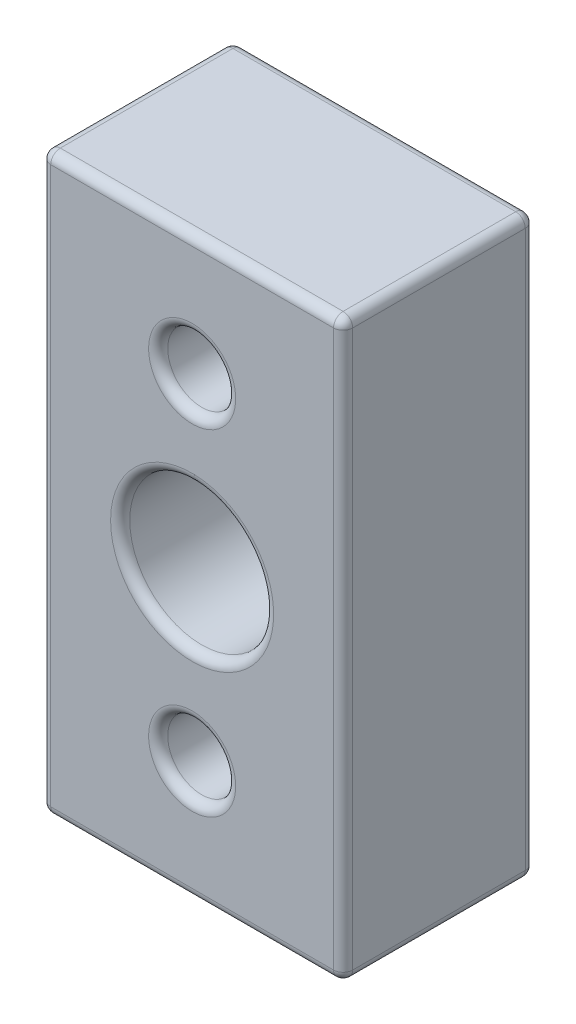
ISO-10303-21;
HEADER;
FILE_DESCRIPTION(('STEP AP214'),'2;1');
FILE_NAME('part.step','',(''),(''),'','','');
FILE_SCHEMA(('AUTOMOTIVE_DESIGN { 1 0 10303 214 1 1 1 1 }'));
ENDSEC;
DATA;
#1=APPLICATION_CONTEXT('core data for automotive mechanical design processes');
#2=APPLICATION_PROTOCOL_DEFINITION('international standard','automotive_design',2000,#1);
#3=PRODUCT_CONTEXT('',#1,'mechanical');
#4=PRODUCT('Part','Part','',(#3));
#5=PRODUCT_RELATED_PRODUCT_CATEGORY('part','',(#4));
#6=PRODUCT_DEFINITION_FORMATION('','',#4);
#7=PRODUCT_DEFINITION_CONTEXT('part definition',#1,'design');
#8=PRODUCT_DEFINITION('design','',#6,#7);
#9=PRODUCT_DEFINITION_SHAPE('','',#8);
#10=(LENGTH_UNIT() NAMED_UNIT(*) SI_UNIT(.MILLI.,.METRE.));
#11=(NAMED_UNIT(*) PLANE_ANGLE_UNIT() SI_UNIT($,.RADIAN.));
#12=(NAMED_UNIT(*) SI_UNIT($,.STERADIAN.) SOLID_ANGLE_UNIT());
#13=UNCERTAINTY_MEASURE_WITH_UNIT(LENGTH_MEASURE(1.E-05),#10,'distance_accuracy_value','');
#14=(GEOMETRIC_REPRESENTATION_CONTEXT(3) GLOBAL_UNCERTAINTY_ASSIGNED_CONTEXT((#13)) GLOBAL_UNIT_ASSIGNED_CONTEXT((#10,
#11,#12)) REPRESENTATION_CONTEXT('',''));
#15=CARTESIAN_POINT('',(0.,0.,0.));
#16=DIRECTION('',(0.,0.,1.));
#17=DIRECTION('',(1.,0.,0.));
#18=AXIS2_PLACEMENT_3D('',#15,#16,#17);
#19=CARTESIAN_POINT('',(20.0025,38.1,25.4));
#20=DIRECTION('',(0.,-1.,0.));
#21=DIRECTION('',(0.,0.,-1.));
#22=AXIS2_PLACEMENT_3D('',#19,#20,#21);
#23=PLANE('',#22);
#24=DIRECTION('',(0.,0.,-1.));
#25=VECTOR('',#24,1.);
#26=CARTESIAN_POINT('',(-18.7325,38.1,25.4));
#27=LINE('',#26,#25);
#28=CARTESIAN_POINT('',(-18.7325,38.1,1.27));
#29=VERTEX_POINT('',#28);
#30=CARTESIAN_POINT('',(-18.7325,38.1,24.13));
#31=VERTEX_POINT('',#30);
#32=EDGE_CURVE('E192',#29,#31,#27,.F.);
#33=ORIENTED_EDGE('',*,*,#32,.T.);
#34=DIRECTION('',(-1.,0.,0.));
#35=VECTOR('',#34,1.);
#36=CARTESIAN_POINT('',(20.0025,38.1,24.13));
#37=LINE('',#36,#35);
#38=CARTESIAN_POINT('',(18.7325,38.1,24.13));
#39=VERTEX_POINT('',#38);
#40=EDGE_CURVE('E199',#31,#39,#37,.F.);
#41=ORIENTED_EDGE('',*,*,#40,.T.);
#42=DIRECTION('',(0.,0.,-1.));
#43=VECTOR('',#42,1.);
#44=CARTESIAN_POINT('',(18.7325,38.1,25.4));
#45=LINE('',#44,#43);
#46=CARTESIAN_POINT('',(18.7325,38.1,1.27));
#47=VERTEX_POINT('',#46);
#48=EDGE_CURVE('E195',#39,#47,#45,.T.);
#49=ORIENTED_EDGE('',*,*,#48,.T.);
#50=DIRECTION('',(-1.,0.,0.));
#51=VECTOR('',#50,1.);
#52=CARTESIAN_POINT('',(-20.0025,38.1,1.27));
#53=LINE('',#52,#51);
#54=EDGE_CURVE('E189',#47,#29,#53,.T.);
#55=ORIENTED_EDGE('',*,*,#54,.T.);
#56=EDGE_LOOP('',(#33,#41,#49,#55));
#57=FACE_BOUND('',#56,.T.);
#58=ADVANCED_FACE('F45',(#57),#23,.F.);
#59=CARTESIAN_POINT('',(-20.0025,-38.1,25.4));
#60=DIRECTION('',(1.,0.,0.));
#61=DIRECTION('',(0.,0.,-1.));
#62=AXIS2_PLACEMENT_3D('',#59,#60,#61);
#63=PLANE('',#62);
#64=DIRECTION('',(0.,0.,-1.));
#65=VECTOR('',#64,1.);
#66=CARTESIAN_POINT('',(-20.0025,-36.83,25.4));
#67=LINE('',#66,#65);
#68=CARTESIAN_POINT('',(-20.0025,-36.83,1.27));
#69=VERTEX_POINT('',#68);
#70=CARTESIAN_POINT('',(-20.0025,-36.83,24.13));
#71=VERTEX_POINT('',#70);
#72=EDGE_CURVE('E205',#69,#71,#67,.F.);
#73=ORIENTED_EDGE('',*,*,#72,.T.);
#74=DIRECTION('',(0.,-1.,0.));
#75=VECTOR('',#74,1.);
#76=CARTESIAN_POINT('',(-20.0025,-38.1,24.13));
#77=LINE('',#76,#75);
#78=CARTESIAN_POINT('',(-20.0025,36.83,24.13));
#79=VERTEX_POINT('',#78);
#80=EDGE_CURVE('E212',#71,#79,#77,.F.);
#81=ORIENTED_EDGE('',*,*,#80,.T.);
#82=DIRECTION('',(0.,0.,-1.));
#83=VECTOR('',#82,1.);
#84=CARTESIAN_POINT('',(-20.0025,36.83,25.4));
#85=LINE('',#84,#83);
#86=CARTESIAN_POINT('',(-20.0025,36.83,1.27));
#87=VERTEX_POINT('',#86);
#88=EDGE_CURVE('E208',#79,#87,#85,.T.);
#89=ORIENTED_EDGE('',*,*,#88,.T.);
#90=DIRECTION('',(0.,-1.,0.));
#91=VECTOR('',#90,1.);
#92=CARTESIAN_POINT('',(-20.0025,-38.1,1.27));
#93=LINE('',#92,#91);
#94=EDGE_CURVE('E202',#87,#69,#93,.T.);
#95=ORIENTED_EDGE('',*,*,#94,.T.);
#96=EDGE_LOOP('',(#73,#81,#89,#95));
#97=FACE_BOUND('',#96,.T.);
#98=ADVANCED_FACE('F401',(#97),#63,.F.);
#99=CARTESIAN_POINT('',(20.0025,-38.1,25.4));
#100=DIRECTION('',(0.,1.,0.));
#101=DIRECTION('',(0.,0.,1.));
#102=AXIS2_PLACEMENT_3D('',#99,#100,#101);
#103=PLANE('',#102);
#104=DIRECTION('',(0.,0.,-1.));
#105=VECTOR('',#104,1.);
#106=CARTESIAN_POINT('',(18.7325,-38.1,25.4));
#107=LINE('',#106,#105);
#108=CARTESIAN_POINT('',(18.7325,-38.1,1.27));
#109=VERTEX_POINT('',#108);
#110=CARTESIAN_POINT('',(18.7325,-38.1,24.13));
#111=VERTEX_POINT('',#110);
#112=EDGE_CURVE('E141',#109,#111,#107,.F.);
#113=ORIENTED_EDGE('',*,*,#112,.T.);
#114=DIRECTION('',(1.,0.,0.));
#115=VECTOR('',#114,1.);
#116=CARTESIAN_POINT('',(20.0025,-38.1,24.13));
#117=LINE('',#116,#115);
#118=CARTESIAN_POINT('',(-18.7325,-38.1,24.13));
#119=VERTEX_POINT('',#118);
#120=EDGE_CURVE('E186',#111,#119,#117,.F.);
#121=ORIENTED_EDGE('',*,*,#120,.T.);
#122=DIRECTION('',(0.,0.,-1.));
#123=VECTOR('',#122,1.);
#124=CARTESIAN_POINT('',(-18.7325,-38.1,25.4));
#125=LINE('',#124,#123);
#126=CARTESIAN_POINT('',(-18.7325,-38.1,1.27));
#127=VERTEX_POINT('',#126);
#128=EDGE_CURVE('E181',#119,#127,#125,.T.);
#129=ORIENTED_EDGE('',*,*,#128,.T.);
#130=DIRECTION('',(1.,0.,0.));
#131=VECTOR('',#130,1.);
#132=CARTESIAN_POINT('',(20.0025,-38.1,1.27));
#133=LINE('',#132,#131);
#134=EDGE_CURVE('E175',#127,#109,#133,.T.);
#135=ORIENTED_EDGE('',*,*,#134,.T.);
#136=EDGE_LOOP('',(#113,#121,#129,#135));
#137=FACE_BOUND('',#136,.T.);
#138=ADVANCED_FACE('F417',(#137),#103,.F.);
#139=CARTESIAN_POINT('',(20.0025,-38.1,25.4));
#140=DIRECTION('',(-1.,0.,0.));
#141=DIRECTION('',(0.,0.,1.));
#142=AXIS2_PLACEMENT_3D('',#139,#140,#141);
#143=PLANE('',#142);
#144=DIRECTION('',(0.,0.,-1.));
#145=VECTOR('',#144,1.);
#146=CARTESIAN_POINT('',(20.0025,36.83,25.4));
#147=LINE('',#146,#145);
#148=CARTESIAN_POINT('',(20.0025,36.83,1.27));
#149=VERTEX_POINT('',#148);
#150=CARTESIAN_POINT('',(20.0025,36.83,24.13));
#151=VERTEX_POINT('',#150);
#152=EDGE_CURVE('E165',#149,#151,#147,.F.);
#153=ORIENTED_EDGE('',*,*,#152,.T.);
#154=DIRECTION('',(0.,1.,0.));
#155=VECTOR('',#154,1.);
#156=CARTESIAN_POINT('',(20.0025,-38.1,24.13));
#157=LINE('',#156,#155);
#158=CARTESIAN_POINT('',(20.0025,-36.83,24.13));
#159=VERTEX_POINT('',#158);
#160=EDGE_CURVE('E169',#151,#159,#157,.F.);
#161=ORIENTED_EDGE('',*,*,#160,.T.);
#162=DIRECTION('',(0.,0.,-1.));
#163=VECTOR('',#162,1.);
#164=CARTESIAN_POINT('',(20.0025,-36.83,25.4));
#165=LINE('',#164,#163);
#166=CARTESIAN_POINT('',(20.0025,-36.83,1.27));
#167=VERTEX_POINT('',#166);
#168=EDGE_CURVE('E139',#159,#167,#165,.T.);
#169=ORIENTED_EDGE('',*,*,#168,.T.);
#170=DIRECTION('',(0.,1.,0.));
#171=VECTOR('',#170,1.);
#172=CARTESIAN_POINT('',(20.0025,38.1,1.27));
#173=LINE('',#172,#171);
#174=EDGE_CURVE('E158',#167,#149,#173,.T.);
#175=ORIENTED_EDGE('',*,*,#174,.T.);
#176=EDGE_LOOP('',(#153,#161,#169,#175));
#177=FACE_BOUND('',#176,.T.);
#178=ADVANCED_FACE('F167',(#177),#143,.F.);
#179=CARTESIAN_POINT('',(0.,0.,25.4));
#180=DIRECTION('',(0.,0.,-1.));
#181=DIRECTION('',(-1.,0.,0.));
#182=AXIS2_PLACEMENT_3D('',#179,#180,#181);
#183=PLANE('',#182);
#184=DIRECTION('',(1.,0.,0.));
#185=VECTOR('',#184,1.);
#186=CARTESIAN_POINT('',(0.,-36.83,25.4));
#187=LINE('',#186,#185);
#188=CARTESIAN_POINT('',(-18.7325,-36.83,25.4));
#189=VERTEX_POINT('',#188);
#190=CARTESIAN_POINT('',(18.7325,-36.83,25.4));
#191=VERTEX_POINT('',#190);
#192=EDGE_CURVE('E233',#189,#191,#187,.T.);
#193=ORIENTED_EDGE('',*,*,#192,.T.);
#194=DIRECTION('',(0.,1.,0.));
#195=VECTOR('',#194,1.);
#196=CARTESIAN_POINT('',(18.7325,0.,25.4));
#197=LINE('',#196,#195);
#198=CARTESIAN_POINT('',(18.7325,36.83,25.4));
#199=VERTEX_POINT('',#198);
#200=EDGE_CURVE('E236',#191,#199,#197,.T.);
#201=ORIENTED_EDGE('',*,*,#200,.T.);
#202=DIRECTION('',(-1.,0.,0.));
#203=VECTOR('',#202,1.);
#204=CARTESIAN_POINT('',(0.,36.83,25.4));
#205=LINE('',#204,#203);
#206=CARTESIAN_POINT('',(-18.7325,36.83,25.4));
#207=VERTEX_POINT('',#206);
#208=EDGE_CURVE('E227',#199,#207,#205,.T.);
#209=ORIENTED_EDGE('',*,*,#208,.T.);
#210=DIRECTION('',(0.,-1.,0.));
#211=VECTOR('',#210,1.);
#212=CARTESIAN_POINT('',(-18.7325,0.,25.4));
#213=LINE('',#212,#211);
#214=EDGE_CURVE('E230',#207,#189,#213,.T.);
#215=ORIENTED_EDGE('',*,*,#214,.T.);
#216=EDGE_LOOP('',(#193,#201,#209,#215));
#217=FACE_BOUND('',#216,.T.);
#218=CARTESIAN_POINT('',(0.,0.,25.4));
#219=DIRECTION('',(0.,0.,-1.));
#220=DIRECTION('',(-1.,0.,0.));
#221=AXIS2_PLACEMENT_3D('',#218,#219,#220);
#222=CIRCLE('',#221,10.80008);
#223=CARTESIAN_POINT('',(-10.80008,0.,25.4));
#224=VERTEX_POINT('',#223);
#225=EDGE_CURVE('E223',#224,#224,#222,.T.);
#226=ORIENTED_EDGE('',*,*,#225,.T.);
#227=EDGE_LOOP('',(#226));
#228=FACE_BOUND('',#227,.T.);
#229=CARTESIAN_POINT('',(0.,-22.225,25.4));
#230=DIRECTION('',(0.,0.,-1.));
#231=DIRECTION('',(-1.,0.,0.));
#232=AXIS2_PLACEMENT_3D('',#229,#230,#231);
#233=CIRCLE('',#232,5.76961);
#234=CARTESIAN_POINT('',(-5.76961,-22.225,25.4));
#235=VERTEX_POINT('',#234);
#236=EDGE_CURVE('E219',#235,#235,#233,.T.);
#237=ORIENTED_EDGE('',*,*,#236,.T.);
#238=EDGE_LOOP('',(#237));
#239=FACE_BOUND('',#238,.T.);
#240=CARTESIAN_POINT('',(0.,22.225,25.4));
#241=DIRECTION('',(0.,0.,-1.));
#242=DIRECTION('',(-1.,0.,0.));
#243=AXIS2_PLACEMENT_3D('',#240,#241,#242);
#244=CIRCLE('',#243,5.76961);
#245=CARTESIAN_POINT('',(-5.76961,22.225,25.4));
#246=VERTEX_POINT('',#245);
#247=EDGE_CURVE('E215',#246,#246,#244,.T.);
#248=ORIENTED_EDGE('',*,*,#247,.T.);
#249=EDGE_LOOP('',(#248));
#250=FACE_BOUND('',#249,.T.);
#251=ADVANCED_FACE('F379',(#217,#228,#239,#250),#183,.F.);
#252=CARTESIAN_POINT('',(0.,0.,0.));
#253=DIRECTION('',(0.,0.,-1.));
#254=DIRECTION('',(-1.,0.,0.));
#255=AXIS2_PLACEMENT_3D('',#252,#253,#254);
#256=PLANE('',#255);
#257=DIRECTION('',(1.,0.,0.));
#258=VECTOR('',#257,1.);
#259=CARTESIAN_POINT('',(-20.0025,-36.83,0.));
#260=LINE('',#259,#258);
#261=CARTESIAN_POINT('',(18.7325,-36.83,0.));
#262=VERTEX_POINT('',#261);
#263=CARTESIAN_POINT('',(-18.7325,-36.83,0.));
#264=VERTEX_POINT('',#263);
#265=EDGE_CURVE('E55',#262,#264,#260,.F.);
#266=ORIENTED_EDGE('',*,*,#265,.T.);
#267=DIRECTION('',(0.,-1.,0.));
#268=VECTOR('',#267,1.);
#269=CARTESIAN_POINT('',(-18.7325,38.1,0.));
#270=LINE('',#269,#268);
#271=CARTESIAN_POINT('',(-18.7325,36.83,0.));
#272=VERTEX_POINT('',#271);
#273=EDGE_CURVE('E11',#264,#272,#270,.F.);
#274=ORIENTED_EDGE('',*,*,#273,.T.);
#275=DIRECTION('',(-1.,0.,0.));
#276=VECTOR('',#275,1.);
#277=CARTESIAN_POINT('',(20.0025,36.83,0.));
#278=LINE('',#277,#276);
#279=CARTESIAN_POINT('',(18.7325,36.83,0.));
#280=VERTEX_POINT('',#279);
#281=EDGE_CURVE('E276',#272,#280,#278,.F.);
#282=ORIENTED_EDGE('',*,*,#281,.T.);
#283=DIRECTION('',(0.,1.,0.));
#284=VECTOR('',#283,1.);
#285=CARTESIAN_POINT('',(18.7325,-38.1,0.));
#286=LINE('',#285,#284);
#287=EDGE_CURVE('E66',#280,#262,#286,.F.);
#288=ORIENTED_EDGE('',*,*,#287,.T.);
#289=EDGE_LOOP('',(#266,#274,#282,#288));
#290=FACE_BOUND('',#289,.T.);
#291=CARTESIAN_POINT('',(0.,0.,0.));
#292=DIRECTION('',(0.,0.,-1.));
#293=DIRECTION('',(-1.,0.,0.));
#294=AXIS2_PLACEMENT_3D('',#291,#292,#293);
#295=CIRCLE('',#294,10.80008);
#296=CARTESIAN_POINT('',(-10.80008,0.,0.));
#297=VERTEX_POINT('',#296);
#298=EDGE_CURVE('E272',#297,#297,#295,.F.);
#299=ORIENTED_EDGE('',*,*,#298,.T.);
#300=EDGE_LOOP('',(#299));
#301=FACE_BOUND('',#300,.T.);
#302=CARTESIAN_POINT('',(0.,-22.225,0.));
#303=DIRECTION('',(0.,0.,-1.));
#304=DIRECTION('',(-1.,0.,0.));
#305=AXIS2_PLACEMENT_3D('',#302,#303,#304);
#306=CIRCLE('',#305,5.76961);
#307=CARTESIAN_POINT('',(-5.76961,-22.225,0.));
#308=VERTEX_POINT('',#307);
#309=EDGE_CURVE('E268',#308,#308,#306,.F.);
#310=ORIENTED_EDGE('',*,*,#309,.T.);
#311=EDGE_LOOP('',(#310));
#312=FACE_BOUND('',#311,.T.);
#313=CARTESIAN_POINT('',(0.,22.225,0.));
#314=DIRECTION('',(0.,0.,-1.));
#315=DIRECTION('',(-1.,0.,0.));
#316=AXIS2_PLACEMENT_3D('',#313,#314,#315);
#317=CIRCLE('',#316,5.76961);
#318=CARTESIAN_POINT('',(-5.76961,22.225,0.));
#319=VERTEX_POINT('',#318);
#320=EDGE_CURVE('E264',#319,#319,#317,.F.);
#321=ORIENTED_EDGE('',*,*,#320,.T.);
#322=EDGE_LOOP('',(#321));
#323=FACE_BOUND('',#322,.T.);
#324=ADVANCED_FACE('F671',(#290,#301,#312,#323),#256,.T.);
#325=CARTESIAN_POINT('',(0.,0.,0.));
#326=DIRECTION('',(0.,0.,1.));
#327=DIRECTION('',(1.,0.,0.));
#328=AXIS2_PLACEMENT_3D('',#325,#326,#327);
#329=CYLINDRICAL_SURFACE('',#328,9.53008);
#330=CARTESIAN_POINT('',(0.,0.,24.13));
#331=DIRECTION('',(0.,0.,-1.));
#332=DIRECTION('',(-1.,0.,0.));
#333=AXIS2_PLACEMENT_3D('',#330,#331,#332);
#334=CIRCLE('',#333,9.53008);
#335=CARTESIAN_POINT('',(-9.53008,0.,24.13));
#336=VERTEX_POINT('',#335);
#337=EDGE_CURVE('E244',#336,#336,#334,.F.);
#338=ORIENTED_EDGE('',*,*,#337,.T.);
#339=EDGE_LOOP('',(#338));
#340=FACE_BOUND('',#339,.T.);
#341=CARTESIAN_POINT('',(0.,0.,1.27));
#342=DIRECTION('',(0.,0.,-1.));
#343=DIRECTION('',(-1.,0.,0.));
#344=AXIS2_PLACEMENT_3D('',#341,#342,#343);
#345=CIRCLE('',#344,9.53008);
#346=CARTESIAN_POINT('',(-9.53008,0.,1.27));
#347=VERTEX_POINT('',#346);
#348=EDGE_CURVE('E240',#347,#347,#345,.T.);
#349=ORIENTED_EDGE('',*,*,#348,.T.);
#350=EDGE_LOOP('',(#349));
#351=FACE_BOUND('',#350,.T.);
#352=ADVANCED_FACE('F662',(#340,#351),#329,.F.);
#353=CARTESIAN_POINT('',(0.,-22.225,0.));
#354=DIRECTION('',(0.,0.,1.));
#355=DIRECTION('',(1.,0.,0.));
#356=AXIS2_PLACEMENT_3D('',#353,#354,#355);
#357=CYLINDRICAL_SURFACE('',#356,4.49961);
#358=CARTESIAN_POINT('',(0.,-22.225,24.13));
#359=DIRECTION('',(0.,0.,-1.));
#360=DIRECTION('',(-1.,0.,0.));
#361=AXIS2_PLACEMENT_3D('',#358,#359,#360);
#362=CIRCLE('',#361,4.49961);
#363=CARTESIAN_POINT('',(-4.49961,-22.225,24.13));
#364=VERTEX_POINT('',#363);
#365=EDGE_CURVE('E252',#364,#364,#362,.F.);
#366=ORIENTED_EDGE('',*,*,#365,.T.);
#367=EDGE_LOOP('',(#366));
#368=FACE_BOUND('',#367,.T.);
#369=CARTESIAN_POINT('',(0.,-22.225,1.27));
#370=DIRECTION('',(0.,0.,-1.));
#371=DIRECTION('',(-1.,0.,0.));
#372=AXIS2_PLACEMENT_3D('',#369,#370,#371);
#373=CIRCLE('',#372,4.49961);
#374=CARTESIAN_POINT('',(-4.49961,-22.225,1.27));
#375=VERTEX_POINT('',#374);
#376=EDGE_CURVE('E248',#375,#375,#373,.T.);
#377=ORIENTED_EDGE('',*,*,#376,.T.);
#378=EDGE_LOOP('',(#377));
#379=FACE_BOUND('',#378,.T.);
#380=ADVANCED_FACE('F653',(#368,#379),#357,.F.);
#381=CARTESIAN_POINT('',(0.,22.225,0.));
#382=DIRECTION('',(0.,0.,1.));
#383=DIRECTION('',(1.,0.,0.));
#384=AXIS2_PLACEMENT_3D('',#381,#382,#383);
#385=CYLINDRICAL_SURFACE('',#384,4.49961);
#386=CARTESIAN_POINT('',(0.,22.225,24.13));
#387=DIRECTION('',(0.,0.,-1.));
#388=DIRECTION('',(-1.,0.,0.));
#389=AXIS2_PLACEMENT_3D('',#386,#387,#388);
#390=CIRCLE('',#389,4.49961);
#391=CARTESIAN_POINT('',(-4.49961,22.225,24.13));
#392=VERTEX_POINT('',#391);
#393=EDGE_CURVE('E260',#392,#392,#390,.F.);
#394=ORIENTED_EDGE('',*,*,#393,.T.);
#395=EDGE_LOOP('',(#394));
#396=FACE_BOUND('',#395,.T.);
#397=CARTESIAN_POINT('',(0.,22.225,1.27));
#398=DIRECTION('',(0.,0.,-1.));
#399=DIRECTION('',(-1.,0.,0.));
#400=AXIS2_PLACEMENT_3D('',#397,#398,#399);
#401=CIRCLE('',#400,4.49961);
#402=CARTESIAN_POINT('',(-4.49961,22.225,1.27));
#403=VERTEX_POINT('',#402);
#404=EDGE_CURVE('E256',#403,#403,#401,.T.);
#405=ORIENTED_EDGE('',*,*,#404,.T.);
#406=EDGE_LOOP('',(#405));
#407=FACE_BOUND('',#406,.T.);
#408=ADVANCED_FACE('F645',(#396,#407),#385,.F.);
#409=CARTESIAN_POINT('',(-18.7325,36.83,25.4));
#410=DIRECTION('',(0.,0.,-1.));
#411=DIRECTION('',(-1.,0.,0.));
#412=AXIS2_PLACEMENT_3D('',#409,#410,#411);
#413=CYLINDRICAL_SURFACE('',#412,1.27);
#414=CARTESIAN_POINT('',(-18.7325,36.83,24.13));
#415=DIRECTION('',(0.,0.,1.));
#416=DIRECTION('',(1.,0.,0.));
#417=AXIS2_PLACEMENT_3D('',#414,#415,#416);
#418=CIRCLE('',#417,1.27);
#419=EDGE_CURVE('E49',#31,#79,#418,.T.);
#420=ORIENTED_EDGE('',*,*,#419,.F.);
#421=ORIENTED_EDGE('',*,*,#32,.F.);
#422=CARTESIAN_POINT('',(-18.7325,36.83,1.27));
#423=DIRECTION('',(0.,0.,-1.));
#424=DIRECTION('',(-1.,0.,0.));
#425=AXIS2_PLACEMENT_3D('',#422,#423,#424);
#426=CIRCLE('',#425,1.27);
#427=EDGE_CURVE('E353',#87,#29,#426,.T.);
#428=ORIENTED_EDGE('',*,*,#427,.F.);
#429=ORIENTED_EDGE('',*,*,#88,.F.);
#430=EDGE_LOOP('',(#420,#421,#428,#429));
#431=FACE_BOUND('',#430,.T.);
#432=ADVANCED_FACE('F399',(#431),#413,.T.);
#433=CARTESIAN_POINT('',(-18.7325,36.83,24.13));
#434=DIRECTION('',(-1.,0.,0.));
#435=DIRECTION('',(0.,-1.,0.));
#436=AXIS2_PLACEMENT_3D('',#433,#434,#435);
#437=SPHERICAL_SURFACE('',#436,1.27);
#438=CARTESIAN_POINT('',(-18.7325,36.83,24.13));
#439=DIRECTION('',(-1.,0.,0.));
#440=DIRECTION('',(0.,0.,1.));
#441=AXIS2_PLACEMENT_3D('',#438,#439,#440);
#442=CIRCLE('',#441,1.27);
#443=EDGE_CURVE('E346',#31,#207,#442,.F.);
#444=ORIENTED_EDGE('',*,*,#443,.F.);
#445=ORIENTED_EDGE('',*,*,#419,.T.);
#446=CARTESIAN_POINT('',(-18.7325,36.83,24.13));
#447=DIRECTION('',(0.,1.,0.));
#448=DIRECTION('',(0.,0.,1.));
#449=AXIS2_PLACEMENT_3D('',#446,#447,#448);
#450=CIRCLE('',#449,1.27);
#451=EDGE_CURVE('E350',#207,#79,#450,.F.);
#452=ORIENTED_EDGE('',*,*,#451,.F.);
#453=EDGE_LOOP('',(#444,#445,#452));
#454=FACE_BOUND('',#453,.T.);
#455=ADVANCED_FACE('F366',(#454),#437,.T.);
#456=CARTESIAN_POINT('',(-18.7325,36.83,1.27));
#457=DIRECTION('',(0.,1.,0.));
#458=DIRECTION('',(0.,0.,1.));
#459=AXIS2_PLACEMENT_3D('',#456,#457,#458);
#460=SPHERICAL_SURFACE('',#459,1.27);
#461=CARTESIAN_POINT('',(-18.7325,36.83,1.27));
#462=DIRECTION('',(0.,1.,0.));
#463=DIRECTION('',(-1.,0.,0.));
#464=AXIS2_PLACEMENT_3D('',#461,#462,#463);
#465=CIRCLE('',#464,1.27);
#466=EDGE_CURVE('E338',#87,#272,#465,.F.);
#467=ORIENTED_EDGE('',*,*,#466,.F.);
#468=ORIENTED_EDGE('',*,*,#427,.T.);
#469=CARTESIAN_POINT('',(-18.7325,36.83,1.27));
#470=DIRECTION('',(-1.,0.,0.));
#471=DIRECTION('',(0.,0.,1.));
#472=AXIS2_PLACEMENT_3D('',#469,#470,#471);
#473=CIRCLE('',#472,1.27);
#474=EDGE_CURVE('E342',#272,#29,#473,.F.);
#475=ORIENTED_EDGE('',*,*,#474,.F.);
#476=EDGE_LOOP('',(#467,#468,#475));
#477=FACE_BOUND('',#476,.T.);
#478=ADVANCED_FACE('F623',(#477),#460,.T.);
#479=CARTESIAN_POINT('',(-18.7325,0.,24.13));
#480=DIRECTION('',(0.,-1.,0.));
#481=DIRECTION('',(0.,0.,-1.));
#482=AXIS2_PLACEMENT_3D('',#479,#480,#481);
#483=CYLINDRICAL_SURFACE('',#482,1.27);
#484=ORIENTED_EDGE('',*,*,#451,.T.);
#485=ORIENTED_EDGE('',*,*,#80,.F.);
#486=CARTESIAN_POINT('',(-18.7325,-36.83,24.13));
#487=DIRECTION('',(0.,-1.,0.));
#488=DIRECTION('',(0.,0.,-1.));
#489=AXIS2_PLACEMENT_3D('',#486,#487,#488);
#490=CIRCLE('',#489,1.27);
#491=EDGE_CURVE('E330',#189,#71,#490,.T.);
#492=ORIENTED_EDGE('',*,*,#491,.F.);
#493=ORIENTED_EDGE('',*,*,#214,.F.);
#494=EDGE_LOOP('',(#484,#485,#492,#493));
#495=FACE_BOUND('',#494,.T.);
#496=ADVANCED_FACE('F374',(#495),#483,.T.);
#497=CARTESIAN_POINT('',(0.,36.83,24.13));
#498=DIRECTION('',(-1.,0.,0.));
#499=DIRECTION('',(0.,0.,1.));
#500=AXIS2_PLACEMENT_3D('',#497,#498,#499);
#501=CYLINDRICAL_SURFACE('',#500,1.27);
#502=ORIENTED_EDGE('',*,*,#443,.T.);
#503=ORIENTED_EDGE('',*,*,#208,.F.);
#504=CARTESIAN_POINT('',(18.7325,36.83,24.13));
#505=DIRECTION('',(1.,0.,0.));
#506=DIRECTION('',(0.,0.,-1.));
#507=AXIS2_PLACEMENT_3D('',#504,#505,#506);
#508=CIRCLE('',#507,1.27);
#509=EDGE_CURVE('E326',#39,#199,#508,.T.);
#510=ORIENTED_EDGE('',*,*,#509,.F.);
#511=ORIENTED_EDGE('',*,*,#40,.F.);
#512=EDGE_LOOP('',(#502,#503,#510,#511));
#513=FACE_BOUND('',#512,.T.);
#514=ADVANCED_FACE('F386',(#513),#501,.T.);
#515=CARTESIAN_POINT('',(18.7325,36.83,25.4));
#516=DIRECTION('',(0.,0.,-1.));
#517=DIRECTION('',(-1.,0.,0.));
#518=AXIS2_PLACEMENT_3D('',#515,#516,#517);
#519=CYLINDRICAL_SURFACE('',#518,1.27);
#520=CARTESIAN_POINT('',(18.7325,36.83,1.27));
#521=DIRECTION('',(0.,0.,-1.));
#522=DIRECTION('',(-1.,0.,0.));
#523=AXIS2_PLACEMENT_3D('',#520,#521,#522);
#524=CIRCLE('',#523,1.27);
#525=EDGE_CURVE('E318',#47,#149,#524,.T.);
#526=ORIENTED_EDGE('',*,*,#525,.F.);
#527=ORIENTED_EDGE('',*,*,#48,.F.);
#528=CARTESIAN_POINT('',(18.7325,36.83,24.13));
#529=DIRECTION('',(0.,0.,1.));
#530=DIRECTION('',(1.,0.,0.));
#531=AXIS2_PLACEMENT_3D('',#528,#529,#530);
#532=CIRCLE('',#531,1.27);
#533=EDGE_CURVE('E322',#151,#39,#532,.T.);
#534=ORIENTED_EDGE('',*,*,#533,.F.);
#535=ORIENTED_EDGE('',*,*,#152,.F.);
#536=EDGE_LOOP('',(#526,#527,#534,#535));
#537=FACE_BOUND('',#536,.T.);
#538=ADVANCED_FACE('F392',(#537),#519,.T.);
#539=CARTESIAN_POINT('',(20.0025,36.83,1.27));
#540=DIRECTION('',(1.,0.,0.));
#541=DIRECTION('',(0.,0.,-1.));
#542=AXIS2_PLACEMENT_3D('',#539,#540,#541);
#543=CYLINDRICAL_SURFACE('',#542,1.27);
#544=ORIENTED_EDGE('',*,*,#474,.T.);
#545=ORIENTED_EDGE('',*,*,#54,.F.);
#546=CARTESIAN_POINT('',(18.7325,36.83,1.27));
#547=DIRECTION('',(1.,0.,0.));
#548=DIRECTION('',(0.,0.,-1.));
#549=AXIS2_PLACEMENT_3D('',#546,#547,#548);
#550=CIRCLE('',#549,1.27);
#551=EDGE_CURVE('E315',#280,#47,#550,.T.);
#552=ORIENTED_EDGE('',*,*,#551,.F.);
#553=ORIENTED_EDGE('',*,*,#281,.F.);
#554=EDGE_LOOP('',(#544,#545,#552,#553));
#555=FACE_BOUND('',#554,.T.);
#556=ADVANCED_FACE('F398',(#555),#543,.T.);
#557=CARTESIAN_POINT('',(-18.7325,-38.1,1.27));
#558=DIRECTION('',(0.,1.,0.));
#559=DIRECTION('',(0.,0.,1.));
#560=AXIS2_PLACEMENT_3D('',#557,#558,#559);
#561=CYLINDRICAL_SURFACE('',#560,1.27);
#562=ORIENTED_EDGE('',*,*,#466,.T.);
#563=ORIENTED_EDGE('',*,*,#273,.F.);
#564=CARTESIAN_POINT('',(-18.7325,-36.83,1.27));
#565=DIRECTION('',(0.,-1.,0.));
#566=DIRECTION('',(0.,0.,-1.));
#567=AXIS2_PLACEMENT_3D('',#564,#565,#566);
#568=CIRCLE('',#567,1.27);
#569=EDGE_CURVE('E311',#69,#264,#568,.T.);
#570=ORIENTED_EDGE('',*,*,#569,.F.);
#571=ORIENTED_EDGE('',*,*,#94,.F.);
#572=EDGE_LOOP('',(#562,#563,#570,#571));
#573=FACE_BOUND('',#572,.T.);
#574=ADVANCED_FACE('F410',(#573),#561,.T.);
#575=CARTESIAN_POINT('',(-18.7325,-36.83,25.4));
#576=DIRECTION('',(0.,0.,-1.));
#577=DIRECTION('',(-1.,0.,0.));
#578=AXIS2_PLACEMENT_3D('',#575,#576,#577);
#579=CYLINDRICAL_SURFACE('',#578,1.27);
#580=CARTESIAN_POINT('',(-18.7325,-36.83,24.13));
#581=DIRECTION('',(0.,0.,1.));
#582=DIRECTION('',(1.,0.,0.));
#583=AXIS2_PLACEMENT_3D('',#580,#581,#582);
#584=CIRCLE('',#583,1.27);
#585=EDGE_CURVE('E334',#71,#119,#584,.T.);
#586=ORIENTED_EDGE('',*,*,#585,.F.);
#587=ORIENTED_EDGE('',*,*,#72,.F.);
#588=CARTESIAN_POINT('',(-18.7325,-36.83,1.27));
#589=DIRECTION('',(0.,0.,-1.));
#590=DIRECTION('',(-1.,0.,0.));
#591=AXIS2_PLACEMENT_3D('',#588,#589,#590);
#592=CIRCLE('',#591,1.27);
#593=EDGE_CURVE('E307',#127,#69,#592,.T.);
#594=ORIENTED_EDGE('',*,*,#593,.F.);
#595=ORIENTED_EDGE('',*,*,#128,.F.);
#596=EDGE_LOOP('',(#586,#587,#594,#595));
#597=FACE_BOUND('',#596,.T.);
#598=ADVANCED_FACE('F406',(#597),#579,.T.);
#599=CARTESIAN_POINT('',(-18.7325,-36.83,24.13));
#600=DIRECTION('',(-1.,0.,0.));
#601=DIRECTION('',(0.,0.,1.));
#602=AXIS2_PLACEMENT_3D('',#599,#600,#601);
#603=SPHERICAL_SURFACE('',#602,1.27);
#604=ORIENTED_EDGE('',*,*,#491,.T.);
#605=ORIENTED_EDGE('',*,*,#585,.T.);
#606=CARTESIAN_POINT('',(-18.7325,-36.83,24.13));
#607=DIRECTION('',(-1.,0.,0.));
#608=DIRECTION('',(0.,0.,1.));
#609=AXIS2_PLACEMENT_3D('',#606,#607,#608);
#610=CIRCLE('',#609,1.27);
#611=EDGE_CURVE('E303',#189,#119,#610,.F.);
#612=ORIENTED_EDGE('',*,*,#611,.F.);
#613=EDGE_LOOP('',(#604,#605,#612));
#614=FACE_BOUND('',#613,.T.);
#615=ADVANCED_FACE('F420',(#614),#603,.T.);
#616=CARTESIAN_POINT('',(18.7325,36.83,24.13));
#617=DIRECTION('',(0.,1.,0.));
#618=DIRECTION('',(0.,0.,1.));
#619=AXIS2_PLACEMENT_3D('',#616,#617,#618);
#620=SPHERICAL_SURFACE('',#619,1.27);
#621=ORIENTED_EDGE('',*,*,#533,.T.);
#622=ORIENTED_EDGE('',*,*,#509,.T.);
#623=CARTESIAN_POINT('',(18.7325,36.83,24.13));
#624=DIRECTION('',(0.,1.,0.));
#625=DIRECTION('',(0.,0.,1.));
#626=AXIS2_PLACEMENT_3D('',#623,#624,#625);
#627=CIRCLE('',#626,1.27);
#628=EDGE_CURVE('E300',#151,#199,#627,.F.);
#629=ORIENTED_EDGE('',*,*,#628,.F.);
#630=EDGE_LOOP('',(#621,#622,#629));
#631=FACE_BOUND('',#630,.T.);
#632=ADVANCED_FACE('F430',(#631),#620,.T.);
#633=CARTESIAN_POINT('',(18.7325,36.83,1.27));
#634=DIRECTION('',(0.,1.,0.));
#635=DIRECTION('',(0.,0.,1.));
#636=AXIS2_PLACEMENT_3D('',#633,#634,#635);
#637=SPHERICAL_SURFACE('',#636,1.27);
#638=ORIENTED_EDGE('',*,*,#551,.T.);
#639=ORIENTED_EDGE('',*,*,#525,.T.);
#640=CARTESIAN_POINT('',(18.7325,36.83,1.27));
#641=DIRECTION('',(0.,1.,0.));
#642=DIRECTION('',(0.,0.,1.));
#643=AXIS2_PLACEMENT_3D('',#640,#641,#642);
#644=CIRCLE('',#643,1.27);
#645=EDGE_CURVE('E161',#280,#149,#644,.F.);
#646=ORIENTED_EDGE('',*,*,#645,.F.);
#647=EDGE_LOOP('',(#638,#639,#646));
#648=FACE_BOUND('',#647,.T.);
#649=ADVANCED_FACE('F432',(#648),#637,.T.);
#650=CARTESIAN_POINT('',(-18.7325,-36.83,1.27));
#651=DIRECTION('',(-1.,0.,0.));
#652=DIRECTION('',(0.,0.,1.));
#653=AXIS2_PLACEMENT_3D('',#650,#651,#652);
#654=SPHERICAL_SURFACE('',#653,1.27);
#655=ORIENTED_EDGE('',*,*,#593,.T.);
#656=ORIENTED_EDGE('',*,*,#569,.T.);
#657=CARTESIAN_POINT('',(-18.7325,-36.83,1.27));
#658=DIRECTION('',(-1.,0.,0.));
#659=DIRECTION('',(0.,0.,1.));
#660=AXIS2_PLACEMENT_3D('',#657,#658,#659);
#661=CIRCLE('',#660,1.27);
#662=EDGE_CURVE('E294',#127,#264,#661,.F.);
#663=ORIENTED_EDGE('',*,*,#662,.F.);
#664=EDGE_LOOP('',(#655,#656,#663));
#665=FACE_BOUND('',#664,.T.);
#666=ADVANCED_FACE('F412',(#665),#654,.T.);
#667=CARTESIAN_POINT('',(0.,-36.83,24.13));
#668=DIRECTION('',(1.,0.,0.));
#669=DIRECTION('',(0.,0.,-1.));
#670=AXIS2_PLACEMENT_3D('',#667,#668,#669);
#671=CYLINDRICAL_SURFACE('',#670,1.27);
#672=ORIENTED_EDGE('',*,*,#611,.T.);
#673=ORIENTED_EDGE('',*,*,#120,.F.);
#674=CARTESIAN_POINT('',(18.7325,-36.83,24.13));
#675=DIRECTION('',(1.,0.,0.));
#676=DIRECTION('',(0.,0.,-1.));
#677=AXIS2_PLACEMENT_3D('',#674,#675,#676);
#678=CIRCLE('',#677,1.27);
#679=EDGE_CURVE('E290',#191,#111,#678,.T.);
#680=ORIENTED_EDGE('',*,*,#679,.F.);
#681=ORIENTED_EDGE('',*,*,#192,.F.);
#682=EDGE_LOOP('',(#672,#673,#680,#681));
#683=FACE_BOUND('',#682,.T.);
#684=ADVANCED_FACE('F422',(#683),#671,.T.);
#685=CARTESIAN_POINT('',(18.7325,0.,24.13));
#686=DIRECTION('',(0.,1.,0.));
#687=DIRECTION('',(0.,0.,1.));
#688=AXIS2_PLACEMENT_3D('',#685,#686,#687);
#689=CYLINDRICAL_SURFACE('',#688,1.27);
#690=ORIENTED_EDGE('',*,*,#628,.T.);
#691=ORIENTED_EDGE('',*,*,#200,.F.);
#692=CARTESIAN_POINT('',(18.7325,-36.83,24.13));
#693=DIRECTION('',(0.,-1.,0.));
#694=DIRECTION('',(0.,0.,-1.));
#695=AXIS2_PLACEMENT_3D('',#692,#693,#694);
#696=CIRCLE('',#695,1.27);
#697=EDGE_CURVE('E155',#159,#191,#696,.T.);
#698=ORIENTED_EDGE('',*,*,#697,.F.);
#699=ORIENTED_EDGE('',*,*,#160,.F.);
#700=EDGE_LOOP('',(#690,#691,#698,#699));
#701=FACE_BOUND('',#700,.T.);
#702=ADVANCED_FACE('F428',(#701),#689,.T.);
#703=CARTESIAN_POINT('',(18.7325,-38.1,1.27));
#704=DIRECTION('',(0.,-1.,0.));
#705=DIRECTION('',(0.,0.,-1.));
#706=AXIS2_PLACEMENT_3D('',#703,#704,#705);
#707=CYLINDRICAL_SURFACE('',#706,1.27);
#708=ORIENTED_EDGE('',*,*,#645,.T.);
#709=ORIENTED_EDGE('',*,*,#174,.F.);
#710=CARTESIAN_POINT('',(18.7325,-36.83,1.27));
#711=DIRECTION('',(0.,-1.,0.));
#712=DIRECTION('',(0.,0.,-1.));
#713=AXIS2_PLACEMENT_3D('',#710,#711,#712);
#714=CIRCLE('',#713,1.27);
#715=EDGE_CURVE('E148',#262,#167,#714,.T.);
#716=ORIENTED_EDGE('',*,*,#715,.F.);
#717=ORIENTED_EDGE('',*,*,#287,.F.);
#718=EDGE_LOOP('',(#708,#709,#716,#717));
#719=FACE_BOUND('',#718,.T.);
#720=ADVANCED_FACE('F159',(#719),#707,.T.);
#721=CARTESIAN_POINT('',(20.0025,-36.83,1.27));
#722=DIRECTION('',(-1.,0.,0.));
#723=DIRECTION('',(0.,0.,1.));
#724=AXIS2_PLACEMENT_3D('',#721,#722,#723);
#725=CYLINDRICAL_SURFACE('',#724,1.27);
#726=ORIENTED_EDGE('',*,*,#662,.T.);
#727=ORIENTED_EDGE('',*,*,#265,.F.);
#728=CARTESIAN_POINT('',(18.7325,-36.83,1.27));
#729=DIRECTION('',(1.,0.,0.));
#730=DIRECTION('',(0.,0.,-1.));
#731=AXIS2_PLACEMENT_3D('',#728,#729,#730);
#732=CIRCLE('',#731,1.27);
#733=EDGE_CURVE('E152',#109,#262,#732,.T.);
#734=ORIENTED_EDGE('',*,*,#733,.F.);
#735=ORIENTED_EDGE('',*,*,#134,.F.);
#736=EDGE_LOOP('',(#726,#727,#734,#735));
#737=FACE_BOUND('',#736,.T.);
#738=ADVANCED_FACE('F415',(#737),#725,.T.);
#739=CARTESIAN_POINT('',(18.7325,-36.83,24.13));
#740=DIRECTION('',(0.,0.,1.));
#741=DIRECTION('',(1.,0.,0.));
#742=AXIS2_PLACEMENT_3D('',#739,#740,#741);
#743=SPHERICAL_SURFACE('',#742,1.27);
#744=ORIENTED_EDGE('',*,*,#697,.T.);
#745=ORIENTED_EDGE('',*,*,#679,.T.);
#746=CARTESIAN_POINT('',(18.7325,-36.83,24.13));
#747=DIRECTION('',(0.,0.,1.));
#748=DIRECTION('',(1.,0.,0.));
#749=AXIS2_PLACEMENT_3D('',#746,#747,#748);
#750=CIRCLE('',#749,1.27);
#751=EDGE_CURVE('E145',#159,#111,#750,.F.);
#752=ORIENTED_EDGE('',*,*,#751,.F.);
#753=EDGE_LOOP('',(#744,#745,#752));
#754=FACE_BOUND('',#753,.T.);
#755=ADVANCED_FACE('F426',(#754),#743,.T.);
#756=CARTESIAN_POINT('',(18.7325,-36.83,1.27));
#757=DIRECTION('',(0.,0.,-1.));
#758=DIRECTION('',(-1.,0.,0.));
#759=AXIS2_PLACEMENT_3D('',#756,#757,#758);
#760=SPHERICAL_SURFACE('',#759,1.27);
#761=ORIENTED_EDGE('',*,*,#733,.T.);
#762=ORIENTED_EDGE('',*,*,#715,.T.);
#763=CARTESIAN_POINT('',(18.7325,-36.83,1.27));
#764=DIRECTION('',(0.,0.,-1.));
#765=DIRECTION('',(-1.,0.,0.));
#766=AXIS2_PLACEMENT_3D('',#763,#764,#765);
#767=CIRCLE('',#766,1.27);
#768=EDGE_CURVE('E135',#109,#167,#767,.F.);
#769=ORIENTED_EDGE('',*,*,#768,.F.);
#770=EDGE_LOOP('',(#761,#762,#769));
#771=FACE_BOUND('',#770,.T.);
#772=ADVANCED_FACE('F150',(#771),#760,.T.);
#773=CARTESIAN_POINT('',(18.7325,-36.83,25.4));
#774=DIRECTION('',(0.,0.,-1.));
#775=DIRECTION('',(-1.,0.,0.));
#776=AXIS2_PLACEMENT_3D('',#773,#774,#775);
#777=CYLINDRICAL_SURFACE('',#776,1.27);
#778=ORIENTED_EDGE('',*,*,#751,.T.);
#779=ORIENTED_EDGE('',*,*,#112,.F.);
#780=ORIENTED_EDGE('',*,*,#768,.T.);
#781=ORIENTED_EDGE('',*,*,#168,.F.);
#782=EDGE_LOOP('',(#778,#779,#780,#781));
#783=FACE_BOUND('',#782,.T.);
#784=ADVANCED_FACE('F137',(#783),#777,.T.);
#785=CARTESIAN_POINT('',(0.,0.,24.13));
#786=DIRECTION('',(0.,0.,-1.));
#787=DIRECTION('',(-1.,0.,0.));
#788=AXIS2_PLACEMENT_3D('',#785,#786,#787);
#789=TOROIDAL_SURFACE('',#788,10.80008,1.27);
#790=ORIENTED_EDGE('',*,*,#225,.F.);
#791=EDGE_LOOP('',(#790));
#792=FACE_BOUND('',#791,.T.);
#793=ORIENTED_EDGE('',*,*,#337,.F.);
#794=EDGE_LOOP('',(#793));
#795=FACE_BOUND('',#794,.T.);
#796=ADVANCED_FACE('F450',(#792,#795),#789,.T.);
#797=CARTESIAN_POINT('',(0.,-22.225,24.13));
#798=DIRECTION('',(0.,0.,-1.));
#799=DIRECTION('',(-1.,0.,0.));
#800=AXIS2_PLACEMENT_3D('',#797,#798,#799);
#801=TOROIDAL_SURFACE('',#800,5.76961,1.27);
#802=ORIENTED_EDGE('',*,*,#236,.F.);
#803=EDGE_LOOP('',(#802));
#804=FACE_BOUND('',#803,.T.);
#805=ORIENTED_EDGE('',*,*,#365,.F.);
#806=EDGE_LOOP('',(#805));
#807=FACE_BOUND('',#806,.T.);
#808=ADVANCED_FACE('F510',(#804,#807),#801,.T.);
#809=CARTESIAN_POINT('',(0.,22.225,24.13));
#810=DIRECTION('',(0.,0.,-1.));
#811=DIRECTION('',(-1.,0.,0.));
#812=AXIS2_PLACEMENT_3D('',#809,#810,#811);
#813=TOROIDAL_SURFACE('',#812,5.76961,1.27);
#814=ORIENTED_EDGE('',*,*,#247,.F.);
#815=EDGE_LOOP('',(#814));
#816=FACE_BOUND('',#815,.T.);
#817=ORIENTED_EDGE('',*,*,#393,.F.);
#818=EDGE_LOOP('',(#817));
#819=FACE_BOUND('',#818,.T.);
#820=ADVANCED_FACE('F519',(#816,#819),#813,.T.);
#821=CARTESIAN_POINT('',(0.,0.,1.27));
#822=DIRECTION('',(0.,0.,-1.));
#823=DIRECTION('',(-1.,0.,0.));
#824=AXIS2_PLACEMENT_3D('',#821,#822,#823);
#825=TOROIDAL_SURFACE('',#824,10.80008,1.27);
#826=ORIENTED_EDGE('',*,*,#348,.F.);
#827=EDGE_LOOP('',(#826));
#828=FACE_BOUND('',#827,.T.);
#829=ORIENTED_EDGE('',*,*,#298,.F.);
#830=EDGE_LOOP('',(#829));
#831=FACE_BOUND('',#830,.T.);
#832=ADVANCED_FACE('F528',(#828,#831),#825,.T.);
#833=CARTESIAN_POINT('',(0.,-22.225,1.27));
#834=DIRECTION('',(0.,0.,-1.));
#835=DIRECTION('',(-1.,0.,0.));
#836=AXIS2_PLACEMENT_3D('',#833,#834,#835);
#837=TOROIDAL_SURFACE('',#836,5.76961,1.27);
#838=ORIENTED_EDGE('',*,*,#376,.F.);
#839=EDGE_LOOP('',(#838));
#840=FACE_BOUND('',#839,.T.);
#841=ORIENTED_EDGE('',*,*,#309,.F.);
#842=EDGE_LOOP('',(#841));
#843=FACE_BOUND('',#842,.T.);
#844=ADVANCED_FACE('F537',(#840,#843),#837,.T.);
#845=CARTESIAN_POINT('',(0.,22.225,1.27));
#846=DIRECTION('',(0.,0.,-1.));
#847=DIRECTION('',(-1.,0.,0.));
#848=AXIS2_PLACEMENT_3D('',#845,#846,#847);
#849=TOROIDAL_SURFACE('',#848,5.76961,1.27);
#850=ORIENTED_EDGE('',*,*,#404,.F.);
#851=EDGE_LOOP('',(#850));
#852=FACE_BOUND('',#851,.T.);
#853=ORIENTED_EDGE('',*,*,#320,.F.);
#854=EDGE_LOOP('',(#853));
#855=FACE_BOUND('',#854,.T.);
#856=ADVANCED_FACE('F47',(#852,#855),#849,.T.);
#857=CLOSED_SHELL('',(#58,#98,#138,#178,#251,#324,#352,#380,#408,#432,#455,#478,#496,#514,#538,
#556,#574,#598,#615,#632,#649,#666,#684,#702,#720,#738,#755,#772,#784,#796,#808,#820,#832,#844,#856));
#858=MANIFOLD_SOLID_BREP('B2',#857);
#859=ADVANCED_BREP_SHAPE_REPRESENTATION('',(#18,#858),#14);
#860=SHAPE_DEFINITION_REPRESENTATION(#9,#859);
ENDSEC;
END-ISO-10303-21;
